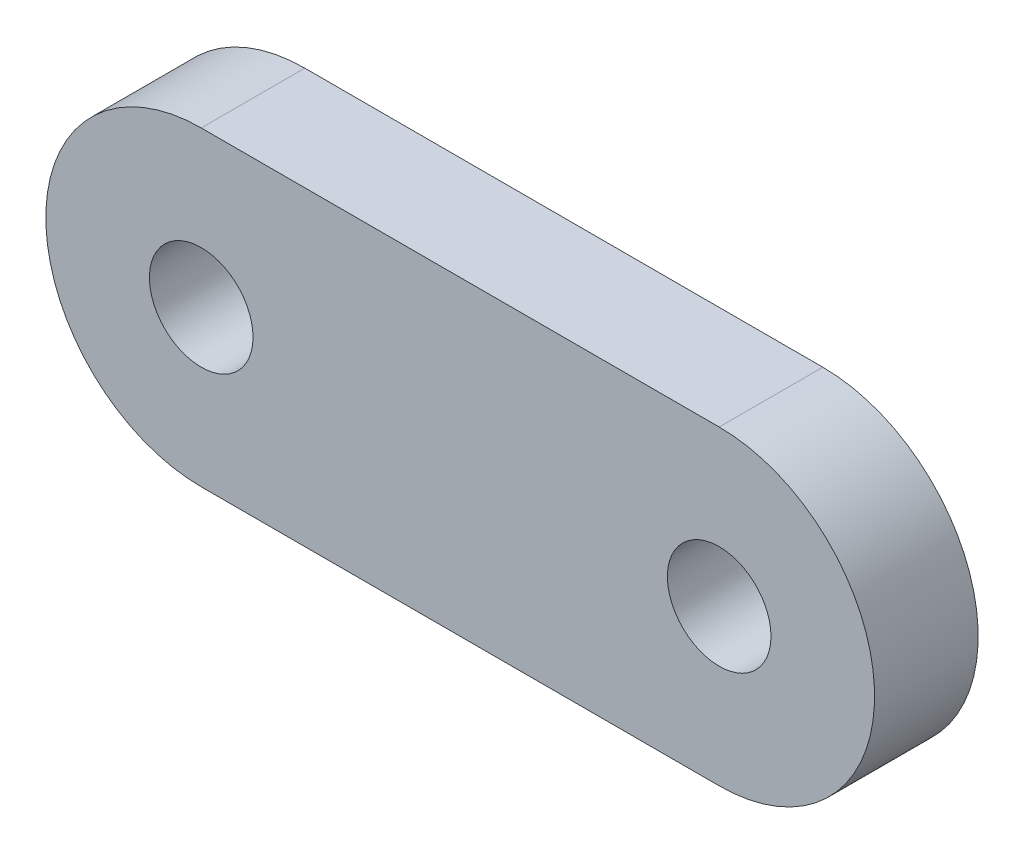
ISO-10303-21;
HEADER;
FILE_DESCRIPTION(('STEP AP214'),'2;1');
FILE_NAME('part.step','',(''),(''),'','','');
FILE_SCHEMA(('AUTOMOTIVE_DESIGN { 1 0 10303 214 1 1 1 1 }'));
ENDSEC;
DATA;
#1=APPLICATION_CONTEXT('core data for automotive mechanical design processes');
#2=APPLICATION_PROTOCOL_DEFINITION('international standard','automotive_design',2000,#1);
#3=PRODUCT_CONTEXT('',#1,'mechanical');
#4=PRODUCT('Part','Part','',(#3));
#5=PRODUCT_RELATED_PRODUCT_CATEGORY('part','',(#4));
#6=PRODUCT_DEFINITION_FORMATION('','',#4);
#7=PRODUCT_DEFINITION_CONTEXT('part definition',#1,'design');
#8=PRODUCT_DEFINITION('design','',#6,#7);
#9=PRODUCT_DEFINITION_SHAPE('','',#8);
#10=(LENGTH_UNIT() NAMED_UNIT(*) SI_UNIT(.MILLI.,.METRE.));
#11=(NAMED_UNIT(*) PLANE_ANGLE_UNIT() SI_UNIT($,.RADIAN.));
#12=(NAMED_UNIT(*) SI_UNIT($,.STERADIAN.) SOLID_ANGLE_UNIT());
#13=UNCERTAINTY_MEASURE_WITH_UNIT(LENGTH_MEASURE(1.E-05),#10,'distance_accuracy_value','');
#14=(GEOMETRIC_REPRESENTATION_CONTEXT(3) GLOBAL_UNCERTAINTY_ASSIGNED_CONTEXT((#13)) GLOBAL_UNIT_ASSIGNED_CONTEXT((#10,
#11,#12)) REPRESENTATION_CONTEXT('',''));
#15=CARTESIAN_POINT('',(0.,0.,0.));
#16=DIRECTION('',(0.,0.,1.));
#17=DIRECTION('',(1.,0.,0.));
#18=AXIS2_PLACEMENT_3D('',#15,#16,#17);
#19=CARTESIAN_POINT('',(0.,0.,2.));
#20=DIRECTION('',(0.,0.,1.));
#21=DIRECTION('',(1.,0.,0.));
#22=AXIS2_PLACEMENT_3D('',#19,#20,#21);
#23=PLANE('',#22);
#24=CARTESIAN_POINT('',(10.,0.,2.));
#25=DIRECTION('',(0.,0.,1.));
#26=DIRECTION('',(1.,0.,0.));
#27=AXIS2_PLACEMENT_3D('',#24,#25,#26);
#28=CIRCLE('',#27,1.);
#29=CARTESIAN_POINT('',(11.,0.,2.));
#30=VERTEX_POINT('',#29);
#31=EDGE_CURVE('E107',#30,#30,#28,.T.);
#32=ORIENTED_EDGE('',*,*,#31,.F.);
#33=EDGE_LOOP('',(#32));
#34=FACE_BOUND('',#33,.T.);
#35=CARTESIAN_POINT('',(0.,0.,2.));
#36=DIRECTION('',(0.,0.,1.));
#37=DIRECTION('',(1.,0.,0.));
#38=AXIS2_PLACEMENT_3D('',#35,#36,#37);
#39=CIRCLE('',#38,3.);
#40=CARTESIAN_POINT('',(0.,3.,2.));
#41=VERTEX_POINT('',#40);
#42=CARTESIAN_POINT('',(0.,-3.,2.));
#43=VERTEX_POINT('',#42);
#44=EDGE_CURVE('E92',#41,#43,#39,.T.);
#45=ORIENTED_EDGE('',*,*,#44,.T.);
#46=DIRECTION('',(1.,0.,0.));
#47=VECTOR('',#46,1.);
#48=CARTESIAN_POINT('',(0.,-3.,2.));
#49=LINE('',#48,#47);
#50=CARTESIAN_POINT('',(10.,-3.,2.));
#51=VERTEX_POINT('',#50);
#52=EDGE_CURVE('E87',#43,#51,#49,.T.);
#53=ORIENTED_EDGE('',*,*,#52,.T.);
#54=CARTESIAN_POINT('',(10.,0.,2.));
#55=DIRECTION('',(0.,0.,1.));
#56=DIRECTION('',(1.,0.,0.));
#57=AXIS2_PLACEMENT_3D('',#54,#55,#56);
#58=CIRCLE('',#57,3.);
#59=CARTESIAN_POINT('',(10.,3.,2.));
#60=VERTEX_POINT('',#59);
#61=EDGE_CURVE('E90',#51,#60,#58,.T.);
#62=ORIENTED_EDGE('',*,*,#61,.T.);
#63=DIRECTION('',(-1.,0.,0.));
#64=VECTOR('',#63,1.);
#65=CARTESIAN_POINT('',(0.,3.,2.));
#66=LINE('',#65,#64);
#67=EDGE_CURVE('E57',#60,#41,#66,.T.);
#68=ORIENTED_EDGE('',*,*,#67,.T.);
#69=EDGE_LOOP('',(#45,#53,#62,#68));
#70=FACE_BOUND('',#69,.T.);
#71=CARTESIAN_POINT('',(0.,0.,2.));
#72=DIRECTION('',(0.,0.,1.));
#73=DIRECTION('',(1.,0.,0.));
#74=AXIS2_PLACEMENT_3D('',#71,#72,#73);
#75=CIRCLE('',#74,1.);
#76=CARTESIAN_POINT('',(1.,0.,2.));
#77=VERTEX_POINT('',#76);
#78=EDGE_CURVE('E122',#77,#77,#75,.T.);
#79=ORIENTED_EDGE('',*,*,#78,.F.);
#80=EDGE_LOOP('',(#79));
#81=FACE_BOUND('',#80,.T.);
#82=ADVANCED_FACE('F40',(#34,#70,#81),#23,.T.);
#83=CARTESIAN_POINT('',(0.,0.,0.));
#84=DIRECTION('',(0.,0.,1.));
#85=DIRECTION('',(1.,0.,0.));
#86=AXIS2_PLACEMENT_3D('',#83,#84,#85);
#87=PLANE('',#86);
#88=CARTESIAN_POINT('',(0.,0.,0.));
#89=DIRECTION('',(0.,0.,1.));
#90=DIRECTION('',(1.,0.,0.));
#91=AXIS2_PLACEMENT_3D('',#88,#89,#90);
#92=CIRCLE('',#91,3.);
#93=CARTESIAN_POINT('',(0.,3.,0.));
#94=VERTEX_POINT('',#93);
#95=CARTESIAN_POINT('',(0.,-3.,0.));
#96=VERTEX_POINT('',#95);
#97=EDGE_CURVE('E104',#94,#96,#92,.T.);
#98=ORIENTED_EDGE('',*,*,#97,.F.);
#99=DIRECTION('',(-1.,0.,0.));
#100=VECTOR('',#99,1.);
#101=CARTESIAN_POINT('',(0.,3.,0.));
#102=LINE('',#101,#100);
#103=CARTESIAN_POINT('',(10.,3.,0.));
#104=VERTEX_POINT('',#103);
#105=EDGE_CURVE('E80',#104,#94,#102,.T.);
#106=ORIENTED_EDGE('',*,*,#105,.F.);
#107=CARTESIAN_POINT('',(10.,0.,0.));
#108=DIRECTION('',(0.,0.,1.));
#109=DIRECTION('',(1.,0.,0.));
#110=AXIS2_PLACEMENT_3D('',#107,#108,#109);
#111=CIRCLE('',#110,3.);
#112=CARTESIAN_POINT('',(10.,-3.,0.));
#113=VERTEX_POINT('',#112);
#114=EDGE_CURVE('E74',#113,#104,#111,.T.);
#115=ORIENTED_EDGE('',*,*,#114,.F.);
#116=DIRECTION('',(1.,0.,0.));
#117=VECTOR('',#116,1.);
#118=CARTESIAN_POINT('',(0.,-3.,0.));
#119=LINE('',#118,#117);
#120=EDGE_CURVE('E96',#96,#113,#119,.T.);
#121=ORIENTED_EDGE('',*,*,#120,.F.);
#122=EDGE_LOOP('',(#98,#106,#115,#121));
#123=FACE_BOUND('',#122,.T.);
#124=CARTESIAN_POINT('',(10.,0.,0.));
#125=DIRECTION('',(0.,0.,1.));
#126=DIRECTION('',(1.,0.,0.));
#127=AXIS2_PLACEMENT_3D('',#124,#125,#126);
#128=CIRCLE('',#127,1.);
#129=CARTESIAN_POINT('',(11.,0.,0.));
#130=VERTEX_POINT('',#129);
#131=EDGE_CURVE('E119',#130,#130,#128,.T.);
#132=ORIENTED_EDGE('',*,*,#131,.T.);
#133=EDGE_LOOP('',(#132));
#134=FACE_BOUND('',#133,.T.);
#135=CARTESIAN_POINT('',(0.,0.,0.));
#136=DIRECTION('',(0.,0.,1.));
#137=DIRECTION('',(1.,0.,0.));
#138=AXIS2_PLACEMENT_3D('',#135,#136,#137);
#139=CIRCLE('',#138,1.);
#140=CARTESIAN_POINT('',(1.,0.,0.));
#141=VERTEX_POINT('',#140);
#142=EDGE_CURVE('E125',#141,#141,#139,.T.);
#143=ORIENTED_EDGE('',*,*,#142,.T.);
#144=EDGE_LOOP('',(#143));
#145=FACE_BOUND('',#144,.T.);
#146=ADVANCED_FACE('F115',(#123,#134,#145),#87,.F.);
#147=CARTESIAN_POINT('',(0.,0.,2.));
#148=DIRECTION('',(0.,0.,-1.));
#149=DIRECTION('',(-1.,0.,0.));
#150=AXIS2_PLACEMENT_3D('',#147,#148,#149);
#151=CYLINDRICAL_SURFACE('',#150,3.);
#152=ORIENTED_EDGE('',*,*,#97,.T.);
#153=DIRECTION('',(0.,0.,-1.));
#154=VECTOR('',#153,1.);
#155=CARTESIAN_POINT('',(0.,-3.,2.));
#156=LINE('',#155,#154);
#157=EDGE_CURVE('E11',#43,#96,#156,.T.);
#158=ORIENTED_EDGE('',*,*,#157,.F.);
#159=ORIENTED_EDGE('',*,*,#44,.F.);
#160=DIRECTION('',(0.,0.,-1.));
#161=VECTOR('',#160,1.);
#162=CARTESIAN_POINT('',(0.,3.,2.));
#163=LINE('',#162,#161);
#164=EDGE_CURVE('E100',#41,#94,#163,.T.);
#165=ORIENTED_EDGE('',*,*,#164,.T.);
#166=EDGE_LOOP('',(#152,#158,#159,#165));
#167=FACE_BOUND('',#166,.T.);
#168=ADVANCED_FACE('F42',(#167),#151,.T.);
#169=CARTESIAN_POINT('',(0.,-3.,2.));
#170=DIRECTION('',(0.,1.,0.));
#171=DIRECTION('',(0.,0.,1.));
#172=AXIS2_PLACEMENT_3D('',#169,#170,#171);
#173=PLANE('',#172);
#174=ORIENTED_EDGE('',*,*,#120,.T.);
#175=DIRECTION('',(0.,0.,-1.));
#176=VECTOR('',#175,1.);
#177=CARTESIAN_POINT('',(10.,-3.,2.));
#178=LINE('',#177,#176);
#179=EDGE_CURVE('E49',#51,#113,#178,.T.);
#180=ORIENTED_EDGE('',*,*,#179,.F.);
#181=ORIENTED_EDGE('',*,*,#52,.F.);
#182=ORIENTED_EDGE('',*,*,#157,.T.);
#183=EDGE_LOOP('',(#174,#180,#181,#182));
#184=FACE_BOUND('',#183,.T.);
#185=ADVANCED_FACE('F95',(#184),#173,.F.);
#186=CARTESIAN_POINT('',(10.,0.,2.));
#187=DIRECTION('',(0.,0.,-1.));
#188=DIRECTION('',(-1.,0.,0.));
#189=AXIS2_PLACEMENT_3D('',#186,#187,#188);
#190=CYLINDRICAL_SURFACE('',#189,3.);
#191=ORIENTED_EDGE('',*,*,#114,.T.);
#192=DIRECTION('',(0.,0.,-1.));
#193=VECTOR('',#192,1.);
#194=CARTESIAN_POINT('',(10.,3.,2.));
#195=LINE('',#194,#193);
#196=EDGE_CURVE('E97',#60,#104,#195,.T.);
#197=ORIENTED_EDGE('',*,*,#196,.F.);
#198=ORIENTED_EDGE('',*,*,#61,.F.);
#199=ORIENTED_EDGE('',*,*,#179,.T.);
#200=EDGE_LOOP('',(#191,#197,#198,#199));
#201=FACE_BOUND('',#200,.T.);
#202=ADVANCED_FACE('F98',(#201),#190,.T.);
#203=CARTESIAN_POINT('',(0.,3.,2.));
#204=DIRECTION('',(0.,-1.,0.));
#205=DIRECTION('',(0.,0.,-1.));
#206=AXIS2_PLACEMENT_3D('',#203,#204,#205);
#207=PLANE('',#206);
#208=ORIENTED_EDGE('',*,*,#105,.T.);
#209=ORIENTED_EDGE('',*,*,#164,.F.);
#210=ORIENTED_EDGE('',*,*,#67,.F.);
#211=ORIENTED_EDGE('',*,*,#196,.T.);
#212=EDGE_LOOP('',(#208,#209,#210,#211));
#213=FACE_BOUND('',#212,.T.);
#214=ADVANCED_FACE('F112',(#213),#207,.F.);
#215=CARTESIAN_POINT('',(10.,0.,2.));
#216=DIRECTION('',(0.,0.,-1.));
#217=DIRECTION('',(-1.,0.,0.));
#218=AXIS2_PLACEMENT_3D('',#215,#216,#217);
#219=CYLINDRICAL_SURFACE('',#218,1.);
#220=ORIENTED_EDGE('',*,*,#31,.T.);
#221=EDGE_LOOP('',(#220));
#222=FACE_BOUND('',#221,.T.);
#223=ORIENTED_EDGE('',*,*,#131,.F.);
#224=EDGE_LOOP('',(#223));
#225=FACE_BOUND('',#224,.T.);
#226=ADVANCED_FACE('F142',(#222,#225),#219,.F.);
#227=CARTESIAN_POINT('',(0.,0.,2.));
#228=DIRECTION('',(0.,0.,-1.));
#229=DIRECTION('',(-1.,0.,0.));
#230=AXIS2_PLACEMENT_3D('',#227,#228,#229);
#231=CYLINDRICAL_SURFACE('',#230,1.);
#232=ORIENTED_EDGE('',*,*,#78,.T.);
#233=EDGE_LOOP('',(#232));
#234=FACE_BOUND('',#233,.T.);
#235=ORIENTED_EDGE('',*,*,#142,.F.);
#236=EDGE_LOOP('',(#235));
#237=FACE_BOUND('',#236,.T.);
#238=ADVANCED_FACE('F131',(#234,#237),#231,.F.);
#239=CLOSED_SHELL('',(#82,#146,#168,#185,#202,#214,#226,#238));
#240=MANIFOLD_SOLID_BREP('B2',#239);
#241=ADVANCED_BREP_SHAPE_REPRESENTATION('',(#18,#240),#14);
#242=SHAPE_DEFINITION_REPRESENTATION(#9,#241);
ENDSEC;
END-ISO-10303-21;
